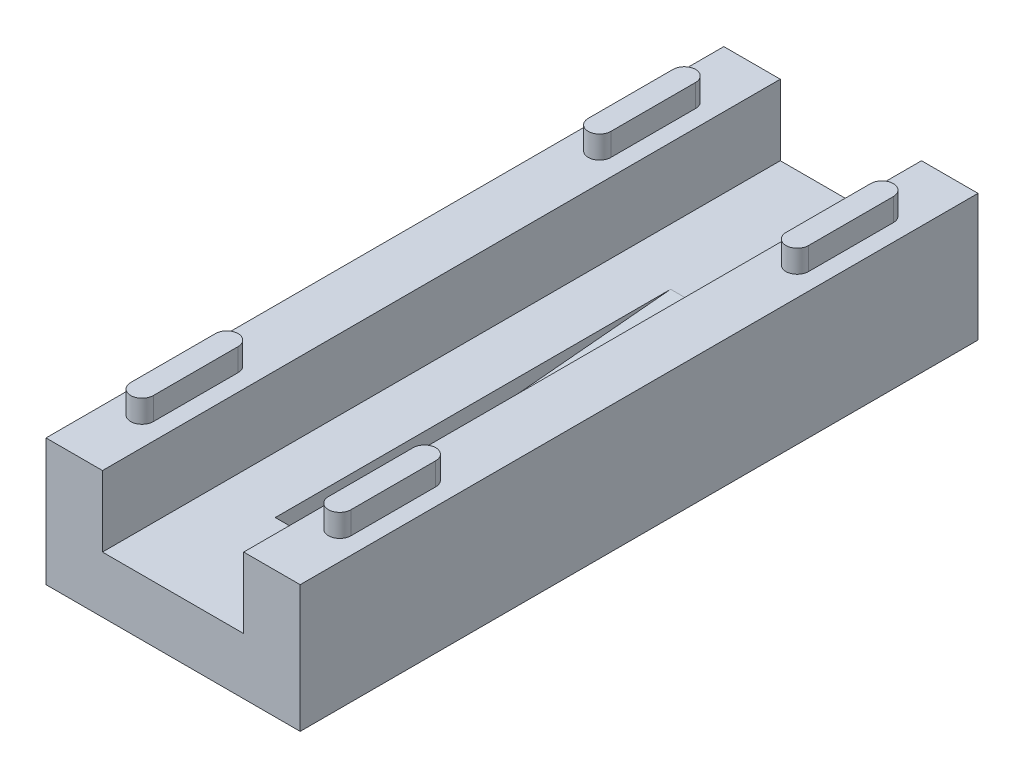
ISO-10303-21;
HEADER;
FILE_DESCRIPTION(('STEP AP214'),'2;1');
FILE_NAME('part.step','',(''),(''),'','','');
FILE_SCHEMA(('AUTOMOTIVE_DESIGN { 1 0 10303 214 1 1 1 1 }'));
ENDSEC;
DATA;
#1=APPLICATION_CONTEXT('core data for automotive mechanical design processes');
#2=APPLICATION_PROTOCOL_DEFINITION('international standard','automotive_design',2000,#1);
#3=PRODUCT_CONTEXT('',#1,'mechanical');
#4=PRODUCT('Part','Part','',(#3));
#5=PRODUCT_RELATED_PRODUCT_CATEGORY('part','',(#4));
#6=PRODUCT_DEFINITION_FORMATION('','',#4);
#7=PRODUCT_DEFINITION_CONTEXT('part definition',#1,'design');
#8=PRODUCT_DEFINITION('design','',#6,#7);
#9=PRODUCT_DEFINITION_SHAPE('','',#8);
#10=(LENGTH_UNIT() NAMED_UNIT(*) SI_UNIT(.MILLI.,.METRE.));
#11=(NAMED_UNIT(*) PLANE_ANGLE_UNIT() SI_UNIT($,.RADIAN.));
#12=(NAMED_UNIT(*) SI_UNIT($,.STERADIAN.) SOLID_ANGLE_UNIT());
#13=UNCERTAINTY_MEASURE_WITH_UNIT(LENGTH_MEASURE(1.E-05),#10,'distance_accuracy_value','');
#14=(GEOMETRIC_REPRESENTATION_CONTEXT(3) GLOBAL_UNCERTAINTY_ASSIGNED_CONTEXT((#13)) GLOBAL_UNIT_ASSIGNED_CONTEXT((#10,
#11,#12)) REPRESENTATION_CONTEXT('',''));
#15=CARTESIAN_POINT('',(0.,0.,0.));
#16=DIRECTION('',(0.,0.,1.));
#17=DIRECTION('',(1.,0.,0.));
#18=AXIS2_PLACEMENT_3D('',#15,#16,#17);
#19=CARTESIAN_POINT('',(22.5,12.5,120.));
#20=DIRECTION('',(0.,-1.,0.));
#21=DIRECTION('',(0.,0.,-1.));
#22=AXIS2_PLACEMENT_3D('',#19,#20,#21);
#23=PLANE('',#22);
#24=DIRECTION('',(-1.,0.,0.));
#25=VECTOR('',#24,1.);
#26=CARTESIAN_POINT('',(22.5,12.5,0.));
#27=LINE('',#26,#25);
#28=CARTESIAN_POINT('',(22.5,12.5,0.));
#29=VERTEX_POINT('',#28);
#30=CARTESIAN_POINT('',(12.5,12.5,0.));
#31=VERTEX_POINT('',#30);
#32=EDGE_CURVE('E487',#29,#31,#27,.T.);
#33=ORIENTED_EDGE('',*,*,#32,.T.);
#34=DIRECTION('',(0.,0.,-1.));
#35=VECTOR('',#34,1.);
#36=CARTESIAN_POINT('',(12.5,12.5,120.));
#37=LINE('',#36,#35);
#38=CARTESIAN_POINT('',(12.5,12.5,120.));
#39=VERTEX_POINT('',#38);
#40=EDGE_CURVE('E502',#39,#31,#37,.T.);
#41=ORIENTED_EDGE('',*,*,#40,.F.);
#42=DIRECTION('',(-1.,0.,0.));
#43=VECTOR('',#42,1.);
#44=CARTESIAN_POINT('',(22.5,12.5,120.));
#45=LINE('',#44,#43);
#46=CARTESIAN_POINT('',(22.5,12.5,120.));
#47=VERTEX_POINT('',#46);
#48=EDGE_CURVE('E462',#47,#39,#45,.T.);
#49=ORIENTED_EDGE('',*,*,#48,.F.);
#50=DIRECTION('',(0.,0.,-1.));
#51=VECTOR('',#50,1.);
#52=CARTESIAN_POINT('',(22.5,12.5,120.));
#53=LINE('',#52,#51);
#54=EDGE_CURVE('E506',#47,#29,#53,.T.);
#55=ORIENTED_EDGE('',*,*,#54,.T.);
#56=EDGE_LOOP('',(#33,#41,#49,#55));
#57=FACE_BOUND('',#56,.T.);
#58=DIRECTION('',(0.,0.,1.));
#59=VECTOR('',#58,1.);
#60=CARTESIAN_POINT('',(19.4999999999985,12.5,108.));
#61=LINE('',#60,#59);
#62=CARTESIAN_POINT('',(19.4999999999987,12.5,93.0000000000003));
#63=VERTEX_POINT('',#62);
#64=CARTESIAN_POINT('',(19.4999999999985,12.5,108.));
#65=VERTEX_POINT('',#64);
#66=EDGE_CURVE('E344',#63,#65,#61,.T.);
#67=ORIENTED_EDGE('',*,*,#66,.T.);
#68=CARTESIAN_POINT('',(17.4999999999985,12.5,108.));
#69=DIRECTION('',(0.,-1.,0.));
#70=DIRECTION('',(-1.,0.,0.));
#71=AXIS2_PLACEMENT_3D('',#68,#69,#70);
#72=CIRCLE('',#71,2.);
#73=CARTESIAN_POINT('',(15.4999999999985,12.5,108.));
#74=VERTEX_POINT('',#73);
#75=EDGE_CURVE('E322',#65,#74,#72,.T.);
#76=ORIENTED_EDGE('',*,*,#75,.T.);
#77=DIRECTION('',(0.,0.,-1.));
#78=VECTOR('',#77,1.);
#79=CARTESIAN_POINT('',(15.4999999999987,12.5,93.0000000000002));
#80=LINE('',#79,#78);
#81=CARTESIAN_POINT('',(15.4999999999987,12.5,93.0000000000002));
#82=VERTEX_POINT('',#81);
#83=EDGE_CURVE('E328',#74,#82,#80,.T.);
#84=ORIENTED_EDGE('',*,*,#83,.T.);
#85=CARTESIAN_POINT('',(17.4999999999987,12.5,93.0000000000003));
#86=DIRECTION('',(0.,-1.,0.));
#87=DIRECTION('',(1.,0.,0.));
#88=AXIS2_PLACEMENT_3D('',#85,#86,#87);
#89=CIRCLE('',#88,2.);
#90=EDGE_CURVE('E348',#82,#63,#89,.T.);
#91=ORIENTED_EDGE('',*,*,#90,.T.);
#92=EDGE_LOOP('',(#67,#76,#84,#91));
#93=FACE_BOUND('',#92,.T.);
#94=CARTESIAN_POINT('',(17.4999999999985,12.5,11.9999999999997));
#95=DIRECTION('',(0.,1.,0.));
#96=DIRECTION('',(-1.,0.,0.));
#97=AXIS2_PLACEMENT_3D('',#94,#95,#96);
#98=CIRCLE('',#97,2.);
#99=CARTESIAN_POINT('',(19.4999999999985,12.5,11.9999999999997));
#100=VERTEX_POINT('',#99);
#101=CARTESIAN_POINT('',(15.4999999999985,12.5,11.9999999999998));
#102=VERTEX_POINT('',#101);
#103=EDGE_CURVE('E239',#100,#102,#98,.T.);
#104=ORIENTED_EDGE('',*,*,#103,.F.);
#105=DIRECTION('',(0.,0.,-1.));
#106=VECTOR('',#105,1.);
#107=CARTESIAN_POINT('',(19.4999999999985,12.5,11.9999999999997));
#108=LINE('',#107,#106);
#109=CARTESIAN_POINT('',(19.4999999999987,12.5,26.9999999999997));
#110=VERTEX_POINT('',#109);
#111=EDGE_CURVE('E286',#110,#100,#108,.T.);
#112=ORIENTED_EDGE('',*,*,#111,.F.);
#113=CARTESIAN_POINT('',(17.4999999999987,12.5,26.9999999999997));
#114=DIRECTION('',(0.,1.,0.));
#115=DIRECTION('',(1.,0.,0.));
#116=AXIS2_PLACEMENT_3D('',#113,#114,#115);
#117=CIRCLE('',#116,2.);
#118=CARTESIAN_POINT('',(15.4999999999987,12.5,26.9999999999998));
#119=VERTEX_POINT('',#118);
#120=EDGE_CURVE('E301',#119,#110,#117,.T.);
#121=ORIENTED_EDGE('',*,*,#120,.F.);
#122=DIRECTION('',(0.,0.,1.));
#123=VECTOR('',#122,1.);
#124=CARTESIAN_POINT('',(15.4999999999987,12.5,26.9999999999998));
#125=LINE('',#124,#123);
#126=EDGE_CURVE('E71',#102,#119,#125,.T.);
#127=ORIENTED_EDGE('',*,*,#126,.F.);
#128=EDGE_LOOP('',(#104,#112,#121,#127));
#129=FACE_BOUND('',#128,.T.);
#130=ADVANCED_FACE('F47',(#57,#93,#129),#23,.F.);
#131=CARTESIAN_POINT('',(-12.5,12.5,120.));
#132=DIRECTION('',(0.,-1.,0.));
#133=DIRECTION('',(1.,0.,0.));
#134=AXIS2_PLACEMENT_3D('',#131,#132,#133);
#135=PLANE('',#134);
#136=DIRECTION('',(0.,0.,-1.));
#137=VECTOR('',#136,1.);
#138=CARTESIAN_POINT('',(-19.5,12.5,12.));
#139=LINE('',#138,#137);
#140=CARTESIAN_POINT('',(-19.5,12.5,27.));
#141=VERTEX_POINT('',#140);
#142=CARTESIAN_POINT('',(-19.5,12.5,12.));
#143=VERTEX_POINT('',#142);
#144=EDGE_CURVE('E266',#141,#143,#139,.T.);
#145=ORIENTED_EDGE('',*,*,#144,.T.);
#146=CARTESIAN_POINT('',(-17.5,12.5,12.));
#147=DIRECTION('',(0.,-1.,0.));
#148=DIRECTION('',(1.,0.,0.));
#149=AXIS2_PLACEMENT_3D('',#146,#147,#148);
#150=CIRCLE('',#149,2.);
#151=CARTESIAN_POINT('',(-15.5,12.5,12.));
#152=VERTEX_POINT('',#151);
#153=EDGE_CURVE('E233',#143,#152,#150,.T.);
#154=ORIENTED_EDGE('',*,*,#153,.T.);
#155=DIRECTION('',(0.,0.,1.));
#156=VECTOR('',#155,1.);
#157=CARTESIAN_POINT('',(-15.5,12.5,27.));
#158=LINE('',#157,#156);
#159=CARTESIAN_POINT('',(-15.5,12.5,27.));
#160=VERTEX_POINT('',#159);
#161=EDGE_CURVE('E251',#152,#160,#158,.T.);
#162=ORIENTED_EDGE('',*,*,#161,.T.);
#163=CARTESIAN_POINT('',(-17.5,12.5,27.));
#164=DIRECTION('',(0.,-1.,0.));
#165=DIRECTION('',(-1.,0.,0.));
#166=AXIS2_PLACEMENT_3D('',#163,#164,#165);
#167=CIRCLE('',#166,2.);
#168=EDGE_CURVE('E63',#160,#141,#167,.T.);
#169=ORIENTED_EDGE('',*,*,#168,.T.);
#170=EDGE_LOOP('',(#145,#154,#162,#169));
#171=FACE_BOUND('',#170,.T.);
#172=DIRECTION('',(-1.,0.,0.));
#173=VECTOR('',#172,1.);
#174=CARTESIAN_POINT('',(-12.5,12.5,0.));
#175=LINE('',#174,#173);
#176=CARTESIAN_POINT('',(-12.5,12.5,0.));
#177=VERTEX_POINT('',#176);
#178=CARTESIAN_POINT('',(-22.5,12.5,0.));
#179=VERTEX_POINT('',#178);
#180=EDGE_CURVE('E475',#177,#179,#175,.T.);
#181=ORIENTED_EDGE('',*,*,#180,.T.);
#182=DIRECTION('',(0.,0.,-1.));
#183=VECTOR('',#182,1.);
#184=CARTESIAN_POINT('',(-22.5,12.5,120.));
#185=LINE('',#184,#183);
#186=CARTESIAN_POINT('',(-22.5,12.5,120.));
#187=VERTEX_POINT('',#186);
#188=EDGE_CURVE('E56',#187,#179,#185,.T.);
#189=ORIENTED_EDGE('',*,*,#188,.F.);
#190=DIRECTION('',(-1.,0.,0.));
#191=VECTOR('',#190,1.);
#192=CARTESIAN_POINT('',(-12.5,12.5,120.));
#193=LINE('',#192,#191);
#194=CARTESIAN_POINT('',(-12.5,12.5,120.));
#195=VERTEX_POINT('',#194);
#196=EDGE_CURVE('E449',#195,#187,#193,.T.);
#197=ORIENTED_EDGE('',*,*,#196,.F.);
#198=DIRECTION('',(0.,0.,-1.));
#199=VECTOR('',#198,1.);
#200=CARTESIAN_POINT('',(-12.5,12.5,120.));
#201=LINE('',#200,#199);
#202=EDGE_CURVE('E11',#195,#177,#201,.T.);
#203=ORIENTED_EDGE('',*,*,#202,.T.);
#204=EDGE_LOOP('',(#181,#189,#197,#203));
#205=FACE_BOUND('',#204,.T.);
#206=CARTESIAN_POINT('',(-17.5,12.5,108.));
#207=DIRECTION('',(0.,1.,0.));
#208=DIRECTION('',(1.,0.,0.));
#209=AXIS2_PLACEMENT_3D('',#206,#207,#208);
#210=CIRCLE('',#209,2.);
#211=CARTESIAN_POINT('',(-19.5,12.5,108.));
#212=VERTEX_POINT('',#211);
#213=CARTESIAN_POINT('',(-15.5,12.5,108.));
#214=VERTEX_POINT('',#213);
#215=EDGE_CURVE('E367',#212,#214,#210,.T.);
#216=ORIENTED_EDGE('',*,*,#215,.F.);
#217=DIRECTION('',(0.,0.,1.));
#218=VECTOR('',#217,1.);
#219=CARTESIAN_POINT('',(-19.5,12.5,108.));
#220=LINE('',#219,#218);
#221=CARTESIAN_POINT('',(-19.5,12.5,93.));
#222=VERTEX_POINT('',#221);
#223=EDGE_CURVE('E373',#222,#212,#220,.T.);
#224=ORIENTED_EDGE('',*,*,#223,.F.);
#225=CARTESIAN_POINT('',(-17.5,12.5,93.));
#226=DIRECTION('',(0.,1.,0.));
#227=DIRECTION('',(-1.,0.,0.));
#228=AXIS2_PLACEMENT_3D('',#225,#226,#227);
#229=CIRCLE('',#228,2.);
#230=CARTESIAN_POINT('',(-15.5,12.5,93.));
#231=VERTEX_POINT('',#230);
#232=EDGE_CURVE('E390',#231,#222,#229,.T.);
#233=ORIENTED_EDGE('',*,*,#232,.F.);
#234=DIRECTION('',(0.,0.,-1.));
#235=VECTOR('',#234,1.);
#236=CARTESIAN_POINT('',(-15.5,12.5,93.));
#237=LINE('',#236,#235);
#238=EDGE_CURVE('E386',#214,#231,#237,.T.);
#239=ORIENTED_EDGE('',*,*,#238,.F.);
#240=EDGE_LOOP('',(#216,#224,#233,#239));
#241=FACE_BOUND('',#240,.T.);
#242=ADVANCED_FACE('F547',(#171,#205,#241),#135,.F.);
#243=CARTESIAN_POINT('',(12.5,0.,120.));
#244=DIRECTION('',(0.,-1.,0.));
#245=DIRECTION('',(1.,0.,0.));
#246=AXIS2_PLACEMENT_3D('',#243,#244,#245);
#247=PLANE('',#246);
#248=DIRECTION('',(-1.,0.,0.));
#249=VECTOR('',#248,1.);
#250=CARTESIAN_POINT('',(12.5,0.,0.));
#251=LINE('',#250,#249);
#252=CARTESIAN_POINT('',(12.5,0.,0.));
#253=VERTEX_POINT('',#252);
#254=CARTESIAN_POINT('',(-12.5,0.,0.));
#255=VERTEX_POINT('',#254);
#256=EDGE_CURVE('E450',#253,#255,#251,.T.);
#257=ORIENTED_EDGE('',*,*,#256,.T.);
#258=DIRECTION('',(0.,0.,-1.));
#259=VECTOR('',#258,1.);
#260=CARTESIAN_POINT('',(-12.5,0.,120.));
#261=LINE('',#260,#259);
#262=CARTESIAN_POINT('',(-12.5,0.,120.));
#263=VERTEX_POINT('',#262);
#264=EDGE_CURVE('E471',#263,#255,#261,.T.);
#265=ORIENTED_EDGE('',*,*,#264,.F.);
#266=DIRECTION('',(-1.,0.,0.));
#267=VECTOR('',#266,1.);
#268=CARTESIAN_POINT('',(12.5,0.,120.));
#269=LINE('',#268,#267);
#270=CARTESIAN_POINT('',(12.5,0.,120.));
#271=VERTEX_POINT('',#270);
#272=EDGE_CURVE('E468',#271,#263,#269,.T.);
#273=ORIENTED_EDGE('',*,*,#272,.F.);
#274=DIRECTION('',(0.,0.,-1.));
#275=VECTOR('',#274,1.);
#276=CARTESIAN_POINT('',(12.5,0.,120.));
#277=LINE('',#276,#275);
#278=EDGE_CURVE('E498',#271,#253,#277,.T.);
#279=ORIENTED_EDGE('',*,*,#278,.T.);
#280=EDGE_LOOP('',(#257,#265,#273,#279));
#281=FACE_BOUND('',#280,.T.);
#282=DIRECTION('',(0.,0.,1.));
#283=VECTOR('',#282,1.);
#284=CARTESIAN_POINT('',(2.5,0.,29.416511254496));
#285=LINE('',#284,#283);
#286=CARTESIAN_POINT('',(2.5,0.,29.416511254496));
#287=VERTEX_POINT('',#286);
#288=CARTESIAN_POINT('',(2.5,0.,99.416511254496));
#289=VERTEX_POINT('',#288);
#290=EDGE_CURVE('E426',#287,#289,#285,.T.);
#291=ORIENTED_EDGE('',*,*,#290,.T.);
#292=DIRECTION('',(-1.,0.,0.));
#293=VECTOR('',#292,1.);
#294=CARTESIAN_POINT('',(2.5,0.,99.416511254496));
#295=LINE('',#294,#293);
#296=CARTESIAN_POINT('',(-2.5,0.,99.416511254496));
#297=VERTEX_POINT('',#296);
#298=EDGE_CURVE('E436',#289,#297,#295,.T.);
#299=ORIENTED_EDGE('',*,*,#298,.T.);
#300=DIRECTION('',(0.,0.,1.));
#301=VECTOR('',#300,1.);
#302=CARTESIAN_POINT('',(-2.5,0.,29.416511254496));
#303=LINE('',#302,#301);
#304=CARTESIAN_POINT('',(-2.5,0.,29.416511254496));
#305=VERTEX_POINT('',#304);
#306=EDGE_CURVE('E415',#305,#297,#303,.T.);
#307=ORIENTED_EDGE('',*,*,#306,.F.);
#308=DIRECTION('',(-1.,0.,0.));
#309=VECTOR('',#308,1.);
#310=CARTESIAN_POINT('',(2.5,0.,29.416511254496));
#311=LINE('',#310,#309);
#312=EDGE_CURVE('E440',#287,#305,#311,.T.);
#313=ORIENTED_EDGE('',*,*,#312,.F.);
#314=EDGE_LOOP('',(#291,#299,#307,#313));
#315=FACE_BOUND('',#314,.T.);
#316=ADVANCED_FACE('F554',(#281,#315),#247,.F.);
#317=CARTESIAN_POINT('',(-12.5,0.,120.));
#318=DIRECTION('',(-1.,0.,0.));
#319=DIRECTION('',(0.,0.,1.));
#320=AXIS2_PLACEMENT_3D('',#317,#318,#319);
#321=PLANE('',#320);
#322=DIRECTION('',(0.,1.,0.));
#323=VECTOR('',#322,1.);
#324=CARTESIAN_POINT('',(-12.5,0.,0.));
#325=LINE('',#324,#323);
#326=EDGE_CURVE('E444',#255,#177,#325,.T.);
#327=ORIENTED_EDGE('',*,*,#326,.T.);
#328=ORIENTED_EDGE('',*,*,#202,.F.);
#329=DIRECTION('',(0.,1.,0.));
#330=VECTOR('',#329,1.);
#331=CARTESIAN_POINT('',(-12.5,0.,120.));
#332=LINE('',#331,#330);
#333=EDGE_CURVE('E445',#263,#195,#332,.T.);
#334=ORIENTED_EDGE('',*,*,#333,.F.);
#335=ORIENTED_EDGE('',*,*,#264,.T.);
#336=EDGE_LOOP('',(#327,#328,#334,#335));
#337=FACE_BOUND('',#336,.T.);
#338=ADVANCED_FACE('F49',(#337),#321,.F.);
#339=CARTESIAN_POINT('',(-22.5,12.5,120.));
#340=DIRECTION('',(1.,0.,0.));
#341=DIRECTION('',(0.,0.,-1.));
#342=AXIS2_PLACEMENT_3D('',#339,#340,#341);
#343=PLANE('',#342);
#344=DIRECTION('',(0.,-1.,0.));
#345=VECTOR('',#344,1.);
#346=CARTESIAN_POINT('',(-22.5,12.5,0.));
#347=LINE('',#346,#345);
#348=CARTESIAN_POINT('',(-22.5,-10.,0.));
#349=VERTEX_POINT('',#348);
#350=EDGE_CURVE('E478',#179,#349,#347,.T.);
#351=ORIENTED_EDGE('',*,*,#350,.T.);
#352=DIRECTION('',(0.,0.,-1.));
#353=VECTOR('',#352,1.);
#354=CARTESIAN_POINT('',(-22.5,-10.,120.));
#355=LINE('',#354,#353);
#356=CARTESIAN_POINT('',(-22.5,-10.,120.));
#357=VERTEX_POINT('',#356);
#358=EDGE_CURVE('E514',#357,#349,#355,.T.);
#359=ORIENTED_EDGE('',*,*,#358,.F.);
#360=DIRECTION('',(0.,-1.,0.));
#361=VECTOR('',#360,1.);
#362=CARTESIAN_POINT('',(-22.5,12.5,120.));
#363=LINE('',#362,#361);
#364=EDGE_CURVE('E453',#187,#357,#363,.T.);
#365=ORIENTED_EDGE('',*,*,#364,.F.);
#366=ORIENTED_EDGE('',*,*,#188,.T.);
#367=EDGE_LOOP('',(#351,#359,#365,#366));
#368=FACE_BOUND('',#367,.T.);
#369=ADVANCED_FACE('F524',(#368),#343,.F.);
#370=CARTESIAN_POINT('',(-22.5,-10.,120.));
#371=DIRECTION('',(0.,1.,0.));
#372=DIRECTION('',(-1.,0.,0.));
#373=AXIS2_PLACEMENT_3D('',#370,#371,#372);
#374=PLANE('',#373);
#375=DIRECTION('',(1.,0.,0.));
#376=VECTOR('',#375,1.);
#377=CARTESIAN_POINT('',(-22.5,-10.,0.));
#378=LINE('',#377,#376);
#379=CARTESIAN_POINT('',(22.5,-10.,0.));
#380=VERTEX_POINT('',#379);
#381=EDGE_CURVE('E481',#349,#380,#378,.T.);
#382=ORIENTED_EDGE('',*,*,#381,.T.);
#383=DIRECTION('',(0.,0.,-1.));
#384=VECTOR('',#383,1.);
#385=CARTESIAN_POINT('',(22.5,-10.,120.));
#386=LINE('',#385,#384);
#387=CARTESIAN_POINT('',(22.5,-10.,120.));
#388=VERTEX_POINT('',#387);
#389=EDGE_CURVE('E510',#388,#380,#386,.T.);
#390=ORIENTED_EDGE('',*,*,#389,.F.);
#391=DIRECTION('',(1.,0.,0.));
#392=VECTOR('',#391,1.);
#393=CARTESIAN_POINT('',(-22.5,-10.,120.));
#394=LINE('',#393,#392);
#395=EDGE_CURVE('E456',#357,#388,#394,.T.);
#396=ORIENTED_EDGE('',*,*,#395,.F.);
#397=ORIENTED_EDGE('',*,*,#358,.T.);
#398=EDGE_LOOP('',(#382,#390,#396,#397));
#399=FACE_BOUND('',#398,.T.);
#400=ADVANCED_FACE('F535',(#399),#374,.F.);
#401=CARTESIAN_POINT('',(22.5,-10.,120.));
#402=DIRECTION('',(-1.,0.,0.));
#403=DIRECTION('',(0.,-1.,0.));
#404=AXIS2_PLACEMENT_3D('',#401,#402,#403);
#405=PLANE('',#404);
#406=DIRECTION('',(0.,1.,0.));
#407=VECTOR('',#406,1.);
#408=CARTESIAN_POINT('',(22.5,-10.,0.));
#409=LINE('',#408,#407);
#410=EDGE_CURVE('E484',#380,#29,#409,.T.);
#411=ORIENTED_EDGE('',*,*,#410,.T.);
#412=ORIENTED_EDGE('',*,*,#54,.F.);
#413=DIRECTION('',(0.,1.,0.));
#414=VECTOR('',#413,1.);
#415=CARTESIAN_POINT('',(22.5,-10.,120.));
#416=LINE('',#415,#414);
#417=EDGE_CURVE('E459',#388,#47,#416,.T.);
#418=ORIENTED_EDGE('',*,*,#417,.F.);
#419=ORIENTED_EDGE('',*,*,#389,.T.);
#420=EDGE_LOOP('',(#411,#412,#418,#419));
#421=FACE_BOUND('',#420,.T.);
#422=ADVANCED_FACE('F539',(#421),#405,.F.);
#423=CARTESIAN_POINT('',(12.5,12.5,120.));
#424=DIRECTION('',(1.,0.,0.));
#425=DIRECTION('',(0.,1.,0.));
#426=AXIS2_PLACEMENT_3D('',#423,#424,#425);
#427=PLANE('',#426);
#428=DIRECTION('',(0.,-1.,0.));
#429=VECTOR('',#428,1.);
#430=CARTESIAN_POINT('',(12.5,12.5,0.));
#431=LINE('',#430,#429);
#432=EDGE_CURVE('E490',#31,#253,#431,.T.);
#433=ORIENTED_EDGE('',*,*,#432,.T.);
#434=ORIENTED_EDGE('',*,*,#278,.F.);
#435=DIRECTION('',(0.,-1.,0.));
#436=VECTOR('',#435,1.);
#437=CARTESIAN_POINT('',(12.5,12.5,120.));
#438=LINE('',#437,#436);
#439=EDGE_CURVE('E465',#39,#271,#438,.T.);
#440=ORIENTED_EDGE('',*,*,#439,.F.);
#441=ORIENTED_EDGE('',*,*,#40,.T.);
#442=EDGE_LOOP('',(#433,#434,#440,#441));
#443=FACE_BOUND('',#442,.T.);
#444=ADVANCED_FACE('F560',(#443),#427,.F.);
#445=CARTESIAN_POINT('',(0.,0.,120.));
#446=DIRECTION('',(0.,0.,1.));
#447=DIRECTION('',(1.,0.,0.));
#448=AXIS2_PLACEMENT_3D('',#445,#446,#447);
#449=PLANE('',#448);
#450=ORIENTED_EDGE('',*,*,#333,.T.);
#451=ORIENTED_EDGE('',*,*,#196,.T.);
#452=ORIENTED_EDGE('',*,*,#364,.T.);
#453=ORIENTED_EDGE('',*,*,#395,.T.);
#454=ORIENTED_EDGE('',*,*,#417,.T.);
#455=ORIENTED_EDGE('',*,*,#48,.T.);
#456=ORIENTED_EDGE('',*,*,#439,.T.);
#457=ORIENTED_EDGE('',*,*,#272,.T.);
#458=EDGE_LOOP('',(#450,#451,#452,#453,#454,#455,#456,#457));
#459=FACE_BOUND('',#458,.T.);
#460=ADVANCED_FACE('F543',(#459),#449,.T.);
#461=CARTESIAN_POINT('',(0.,0.,0.));
#462=DIRECTION('',(0.,0.,1.));
#463=DIRECTION('',(1.,0.,0.));
#464=AXIS2_PLACEMENT_3D('',#461,#462,#463);
#465=PLANE('',#464);
#466=ORIENTED_EDGE('',*,*,#326,.F.);
#467=ORIENTED_EDGE('',*,*,#256,.F.);
#468=ORIENTED_EDGE('',*,*,#432,.F.);
#469=ORIENTED_EDGE('',*,*,#32,.F.);
#470=ORIENTED_EDGE('',*,*,#410,.F.);
#471=ORIENTED_EDGE('',*,*,#381,.F.);
#472=ORIENTED_EDGE('',*,*,#350,.F.);
#473=ORIENTED_EDGE('',*,*,#180,.F.);
#474=EDGE_LOOP('',(#466,#467,#468,#469,#470,#471,#472,#473));
#475=FACE_BOUND('',#474,.T.);
#476=ADVANCED_FACE('F530',(#475),#465,.F.);
#477=CARTESIAN_POINT('',(2.5,-6.50000000000001,99.416511254496));
#478=DIRECTION('',(0.,0.995716456666751,0.0924593852619127));
#479=DIRECTION('',(0.,-0.0924593852619127,0.995716456666751));
#480=AXIS2_PLACEMENT_3D('',#477,#478,#479);
#481=PLANE('',#480);
#482=DIRECTION('',(-1.,0.,0.));
#483=VECTOR('',#482,1.);
#484=CARTESIAN_POINT('',(2.5,-6.50000000000001,99.416511254496));
#485=LINE('',#484,#483);
#486=CARTESIAN_POINT('',(2.5,-6.50000000000001,99.416511254496));
#487=VERTEX_POINT('',#486);
#488=CARTESIAN_POINT('',(-2.5,-6.50000000000001,99.416511254496));
#489=VERTEX_POINT('',#488);
#490=EDGE_CURVE('E433',#487,#489,#485,.T.);
#491=ORIENTED_EDGE('',*,*,#490,.F.);
#492=DIRECTION('',(0.,0.0924593852619127,-0.995716456666751));
#493=VECTOR('',#492,1.);
#494=CARTESIAN_POINT('',(2.5,-6.50000000000001,99.416511254496));
#495=LINE('',#494,#493);
#496=EDGE_CURVE('E422',#487,#287,#495,.T.);
#497=ORIENTED_EDGE('',*,*,#496,.T.);
#498=ORIENTED_EDGE('',*,*,#312,.T.);
#499=DIRECTION('',(0.,0.0924593852619127,-0.995716456666751));
#500=VECTOR('',#499,1.);
#501=CARTESIAN_POINT('',(-2.5,-6.50000000000001,99.416511254496));
#502=LINE('',#501,#500);
#503=EDGE_CURVE('E412',#489,#305,#502,.T.);
#504=ORIENTED_EDGE('',*,*,#503,.F.);
#505=EDGE_LOOP('',(#491,#497,#498,#504));
#506=FACE_BOUND('',#505,.T.);
#507=ADVANCED_FACE('F644',(#506),#481,.T.);
#508=CARTESIAN_POINT('',(2.5,0.,99.416511254496));
#509=DIRECTION('',(0.,0.,-1.));
#510=DIRECTION('',(-1.,0.,0.));
#511=AXIS2_PLACEMENT_3D('',#508,#509,#510);
#512=PLANE('',#511);
#513=ORIENTED_EDGE('',*,*,#298,.F.);
#514=DIRECTION('',(0.,-1.,0.));
#515=VECTOR('',#514,1.);
#516=CARTESIAN_POINT('',(2.5,0.,99.416511254496));
#517=LINE('',#516,#515);
#518=EDGE_CURVE('E430',#289,#487,#517,.T.);
#519=ORIENTED_EDGE('',*,*,#518,.T.);
#520=ORIENTED_EDGE('',*,*,#490,.T.);
#521=DIRECTION('',(0.,-1.,0.));
#522=VECTOR('',#521,1.);
#523=CARTESIAN_POINT('',(-2.5,0.,99.416511254496));
#524=LINE('',#523,#522);
#525=EDGE_CURVE('E418',#297,#489,#524,.T.);
#526=ORIENTED_EDGE('',*,*,#525,.F.);
#527=EDGE_LOOP('',(#513,#519,#520,#526));
#528=FACE_BOUND('',#527,.T.);
#529=ADVANCED_FACE('F640',(#528),#512,.T.);
#530=CARTESIAN_POINT('',(2.5,0.,0.));
#531=DIRECTION('',(-1.,0.,0.));
#532=DIRECTION('',(0.,0.,1.));
#533=AXIS2_PLACEMENT_3D('',#530,#531,#532);
#534=PLANE('',#533);
#535=ORIENTED_EDGE('',*,*,#496,.F.);
#536=ORIENTED_EDGE('',*,*,#518,.F.);
#537=ORIENTED_EDGE('',*,*,#290,.F.);
#538=EDGE_LOOP('',(#535,#536,#537));
#539=FACE_BOUND('',#538,.T.);
#540=ADVANCED_FACE('F636',(#539),#534,.T.);
#541=CARTESIAN_POINT('',(-2.5,0.,0.));
#542=DIRECTION('',(-1.,0.,0.));
#543=DIRECTION('',(0.,0.,1.));
#544=AXIS2_PLACEMENT_3D('',#541,#542,#543);
#545=PLANE('',#544);
#546=ORIENTED_EDGE('',*,*,#503,.T.);
#547=ORIENTED_EDGE('',*,*,#306,.T.);
#548=ORIENTED_EDGE('',*,*,#525,.T.);
#549=EDGE_LOOP('',(#546,#547,#548));
#550=FACE_BOUND('',#549,.T.);
#551=ADVANCED_FACE('F632',(#550),#545,.F.);
#552=CARTESIAN_POINT('',(-17.5,16.5,108.));
#553=DIRECTION('',(0.,-1.,0.));
#554=DIRECTION('',(1.,0.,0.));
#555=AXIS2_PLACEMENT_3D('',#552,#553,#554);
#556=CYLINDRICAL_SURFACE('',#555,2.);
#557=ORIENTED_EDGE('',*,*,#215,.T.);
#558=DIRECTION('',(0.,-1.,0.));
#559=VECTOR('',#558,1.);
#560=CARTESIAN_POINT('',(-15.5,16.5,108.));
#561=LINE('',#560,#559);
#562=CARTESIAN_POINT('',(-15.5,16.5,108.));
#563=VERTEX_POINT('',#562);
#564=EDGE_CURVE('E408',#563,#214,#561,.T.);
#565=ORIENTED_EDGE('',*,*,#564,.F.);
#566=CARTESIAN_POINT('',(-17.5,16.5,108.));
#567=DIRECTION('',(0.,1.,0.));
#568=DIRECTION('',(1.,0.,0.));
#569=AXIS2_PLACEMENT_3D('',#566,#567,#568);
#570=CIRCLE('',#569,2.);
#571=CARTESIAN_POINT('',(-19.5,16.5,108.));
#572=VERTEX_POINT('',#571);
#573=EDGE_CURVE('E368',#572,#563,#570,.T.);
#574=ORIENTED_EDGE('',*,*,#573,.F.);
#575=DIRECTION('',(0.,-1.,0.));
#576=VECTOR('',#575,1.);
#577=CARTESIAN_POINT('',(-19.5,16.5,108.));
#578=LINE('',#577,#576);
#579=EDGE_CURVE('E382',#572,#212,#578,.T.);
#580=ORIENTED_EDGE('',*,*,#579,.T.);
#581=EDGE_LOOP('',(#557,#565,#574,#580));
#582=FACE_BOUND('',#581,.T.);
#583=ADVANCED_FACE('F628',(#582),#556,.T.);
#584=CARTESIAN_POINT('',(-15.5,16.5,93.));
#585=DIRECTION('',(-1.,0.,0.));
#586=DIRECTION('',(0.,0.,1.));
#587=AXIS2_PLACEMENT_3D('',#584,#585,#586);
#588=PLANE('',#587);
#589=ORIENTED_EDGE('',*,*,#238,.T.);
#590=DIRECTION('',(0.,-1.,0.));
#591=VECTOR('',#590,1.);
#592=CARTESIAN_POINT('',(-15.5,16.5,93.));
#593=LINE('',#592,#591);
#594=CARTESIAN_POINT('',(-15.5,16.5,93.));
#595=VERTEX_POINT('',#594);
#596=EDGE_CURVE('E404',#595,#231,#593,.T.);
#597=ORIENTED_EDGE('',*,*,#596,.F.);
#598=DIRECTION('',(0.,0.,-1.));
#599=VECTOR('',#598,1.);
#600=CARTESIAN_POINT('',(-15.5,16.5,93.));
#601=LINE('',#600,#599);
#602=EDGE_CURVE('E372',#563,#595,#601,.T.);
#603=ORIENTED_EDGE('',*,*,#602,.F.);
#604=ORIENTED_EDGE('',*,*,#564,.T.);
#605=EDGE_LOOP('',(#589,#597,#603,#604));
#606=FACE_BOUND('',#605,.T.);
#607=ADVANCED_FACE('F624',(#606),#588,.F.);
#608=CARTESIAN_POINT('',(-17.5,16.5,93.));
#609=DIRECTION('',(0.,-1.,0.));
#610=DIRECTION('',(1.,0.,0.));
#611=AXIS2_PLACEMENT_3D('',#608,#609,#610);
#612=CYLINDRICAL_SURFACE('',#611,2.);
#613=ORIENTED_EDGE('',*,*,#232,.T.);
#614=DIRECTION('',(0.,-1.,0.));
#615=VECTOR('',#614,1.);
#616=CARTESIAN_POINT('',(-19.5,16.5,93.));
#617=LINE('',#616,#615);
#618=CARTESIAN_POINT('',(-19.5,16.5,93.));
#619=VERTEX_POINT('',#618);
#620=EDGE_CURVE('E400',#619,#222,#617,.T.);
#621=ORIENTED_EDGE('',*,*,#620,.F.);
#622=CARTESIAN_POINT('',(-17.5,16.5,93.));
#623=DIRECTION('',(0.,1.,0.));
#624=DIRECTION('',(-1.,0.,0.));
#625=AXIS2_PLACEMENT_3D('',#622,#623,#624);
#626=CIRCLE('',#625,2.);
#627=EDGE_CURVE('E376',#595,#619,#626,.T.);
#628=ORIENTED_EDGE('',*,*,#627,.F.);
#629=ORIENTED_EDGE('',*,*,#596,.T.);
#630=EDGE_LOOP('',(#613,#621,#628,#629));
#631=FACE_BOUND('',#630,.T.);
#632=ADVANCED_FACE('F620',(#631),#612,.T.);
#633=CARTESIAN_POINT('',(-19.5,16.5,108.));
#634=DIRECTION('',(1.,0.,0.));
#635=DIRECTION('',(0.,0.,-1.));
#636=AXIS2_PLACEMENT_3D('',#633,#634,#635);
#637=PLANE('',#636);
#638=ORIENTED_EDGE('',*,*,#223,.T.);
#639=ORIENTED_EDGE('',*,*,#579,.F.);
#640=DIRECTION('',(0.,0.,1.));
#641=VECTOR('',#640,1.);
#642=CARTESIAN_POINT('',(-19.5,16.5,108.));
#643=LINE('',#642,#641);
#644=EDGE_CURVE('E379',#619,#572,#643,.T.);
#645=ORIENTED_EDGE('',*,*,#644,.F.);
#646=ORIENTED_EDGE('',*,*,#620,.T.);
#647=EDGE_LOOP('',(#638,#639,#645,#646));
#648=FACE_BOUND('',#647,.T.);
#649=ADVANCED_FACE('F616',(#648),#637,.F.);
#650=CARTESIAN_POINT('',(-17.5,16.5,108.));
#651=DIRECTION('',(0.,-1.,0.));
#652=DIRECTION('',(1.,0.,0.));
#653=AXIS2_PLACEMENT_3D('',#650,#651,#652);
#654=PLANE('',#653);
#655=ORIENTED_EDGE('',*,*,#573,.T.);
#656=ORIENTED_EDGE('',*,*,#602,.T.);
#657=ORIENTED_EDGE('',*,*,#627,.T.);
#658=ORIENTED_EDGE('',*,*,#644,.T.);
#659=EDGE_LOOP('',(#655,#656,#657,#658));
#660=FACE_BOUND('',#659,.T.);
#661=ADVANCED_FACE('F612',(#660),#654,.F.);
#662=CARTESIAN_POINT('',(17.4999999999985,16.5,108.));
#663=DIRECTION('',(0.,-1.,0.));
#664=DIRECTION('',(1.,0.,0.));
#665=AXIS2_PLACEMENT_3D('',#662,#663,#664);
#666=CYLINDRICAL_SURFACE('',#665,2.);
#667=ORIENTED_EDGE('',*,*,#75,.F.);
#668=DIRECTION('',(0.,-1.,0.));
#669=VECTOR('',#668,1.);
#670=CARTESIAN_POINT('',(19.4999999999985,16.5,108.));
#671=LINE('',#670,#669);
#672=CARTESIAN_POINT('',(19.4999999999985,16.5,108.));
#673=VERTEX_POINT('',#672);
#674=EDGE_CURVE('E364',#673,#65,#671,.T.);
#675=ORIENTED_EDGE('',*,*,#674,.F.);
#676=CARTESIAN_POINT('',(17.4999999999985,16.5,108.));
#677=DIRECTION('',(0.,-1.,0.));
#678=DIRECTION('',(-1.,0.,0.));
#679=AXIS2_PLACEMENT_3D('',#676,#677,#678);
#680=CIRCLE('',#679,2.);
#681=CARTESIAN_POINT('',(15.4999999999985,16.5,108.));
#682=VERTEX_POINT('',#681);
#683=EDGE_CURVE('E323',#673,#682,#680,.T.);
#684=ORIENTED_EDGE('',*,*,#683,.T.);
#685=DIRECTION('',(0.,-1.,0.));
#686=VECTOR('',#685,1.);
#687=CARTESIAN_POINT('',(15.4999999999985,16.5,108.));
#688=LINE('',#687,#686);
#689=EDGE_CURVE('E340',#682,#74,#688,.T.);
#690=ORIENTED_EDGE('',*,*,#689,.T.);
#691=EDGE_LOOP('',(#667,#675,#684,#690));
#692=FACE_BOUND('',#691,.T.);
#693=ADVANCED_FACE('F608',(#692),#666,.T.);
#694=CARTESIAN_POINT('',(19.4999999999985,16.5,108.));
#695=DIRECTION('',(1.,0.,0.));
#696=DIRECTION('',(0.,0.,-1.));
#697=AXIS2_PLACEMENT_3D('',#694,#695,#696);
#698=PLANE('',#697);
#699=ORIENTED_EDGE('',*,*,#66,.F.);
#700=DIRECTION('',(0.,-1.,0.));
#701=VECTOR('',#700,1.);
#702=CARTESIAN_POINT('',(19.4999999999987,16.5,93.0000000000003));
#703=LINE('',#702,#701);
#704=CARTESIAN_POINT('',(19.4999999999987,16.5,93.0000000000003));
#705=VERTEX_POINT('',#704);
#706=EDGE_CURVE('E361',#705,#63,#703,.T.);
#707=ORIENTED_EDGE('',*,*,#706,.F.);
#708=DIRECTION('',(0.,0.,1.));
#709=VECTOR('',#708,1.);
#710=CARTESIAN_POINT('',(19.4999999999985,16.5,108.));
#711=LINE('',#710,#709);
#712=EDGE_CURVE('E327',#705,#673,#711,.T.);
#713=ORIENTED_EDGE('',*,*,#712,.T.);
#714=ORIENTED_EDGE('',*,*,#674,.T.);
#715=EDGE_LOOP('',(#699,#707,#713,#714));
#716=FACE_BOUND('',#715,.T.);
#717=ADVANCED_FACE('F604',(#716),#698,.T.);
#718=CARTESIAN_POINT('',(17.4999999999987,16.5,93.0000000000003));
#719=DIRECTION('',(0.,-1.,0.));
#720=DIRECTION('',(1.,0.,0.));
#721=AXIS2_PLACEMENT_3D('',#718,#719,#720);
#722=CYLINDRICAL_SURFACE('',#721,2.);
#723=ORIENTED_EDGE('',*,*,#90,.F.);
#724=DIRECTION('',(0.,-1.,0.));
#725=VECTOR('',#724,1.);
#726=CARTESIAN_POINT('',(15.4999999999987,16.5,93.0000000000002));
#727=LINE('',#726,#725);
#728=CARTESIAN_POINT('',(15.4999999999987,16.5,93.0000000000002));
#729=VERTEX_POINT('',#728);
#730=EDGE_CURVE('E357',#729,#82,#727,.T.);
#731=ORIENTED_EDGE('',*,*,#730,.F.);
#732=CARTESIAN_POINT('',(17.4999999999987,16.5,93.0000000000003));
#733=DIRECTION('',(0.,-1.,0.));
#734=DIRECTION('',(1.,0.,0.));
#735=AXIS2_PLACEMENT_3D('',#732,#733,#734);
#736=CIRCLE('',#735,2.);
#737=EDGE_CURVE('E332',#729,#705,#736,.T.);
#738=ORIENTED_EDGE('',*,*,#737,.T.);
#739=ORIENTED_EDGE('',*,*,#706,.T.);
#740=EDGE_LOOP('',(#723,#731,#738,#739));
#741=FACE_BOUND('',#740,.T.);
#742=ADVANCED_FACE('F600',(#741),#722,.T.);
#743=CARTESIAN_POINT('',(15.4999999999987,16.5,93.0000000000002));
#744=DIRECTION('',(-1.,0.,0.));
#745=DIRECTION('',(0.,0.,1.));
#746=AXIS2_PLACEMENT_3D('',#743,#744,#745);
#747=PLANE('',#746);
#748=ORIENTED_EDGE('',*,*,#83,.F.);
#749=ORIENTED_EDGE('',*,*,#689,.F.);
#750=DIRECTION('',(0.,0.,-1.));
#751=VECTOR('',#750,1.);
#752=CARTESIAN_POINT('',(15.4999999999987,16.5,93.0000000000002));
#753=LINE('',#752,#751);
#754=EDGE_CURVE('E336',#682,#729,#753,.T.);
#755=ORIENTED_EDGE('',*,*,#754,.T.);
#756=ORIENTED_EDGE('',*,*,#730,.T.);
#757=EDGE_LOOP('',(#748,#749,#755,#756));
#758=FACE_BOUND('',#757,.T.);
#759=ADVANCED_FACE('F596',(#758),#747,.T.);
#760=CARTESIAN_POINT('',(17.4999999999985,16.5,108.));
#761=DIRECTION('',(0.,-1.,0.));
#762=DIRECTION('',(-1.,0.,0.));
#763=AXIS2_PLACEMENT_3D('',#760,#761,#762);
#764=PLANE('',#763);
#765=ORIENTED_EDGE('',*,*,#683,.F.);
#766=ORIENTED_EDGE('',*,*,#712,.F.);
#767=ORIENTED_EDGE('',*,*,#737,.F.);
#768=ORIENTED_EDGE('',*,*,#754,.F.);
#769=EDGE_LOOP('',(#765,#766,#767,#768));
#770=FACE_BOUND('',#769,.T.);
#771=ADVANCED_FACE('F590',(#770),#764,.F.);
#772=CARTESIAN_POINT('',(17.4999999999985,16.5,11.9999999999997));
#773=DIRECTION('',(0.,-1.,0.));
#774=DIRECTION('',(1.,0.,0.));
#775=AXIS2_PLACEMENT_3D('',#772,#773,#774);
#776=CYLINDRICAL_SURFACE('',#775,2.);
#777=ORIENTED_EDGE('',*,*,#103,.T.);
#778=DIRECTION('',(0.,-1.,0.));
#779=VECTOR('',#778,1.);
#780=CARTESIAN_POINT('',(15.4999999999985,16.5,11.9999999999998));
#781=LINE('',#780,#779);
#782=CARTESIAN_POINT('',(15.4999999999985,16.5,11.9999999999998));
#783=VERTEX_POINT('',#782);
#784=EDGE_CURVE('E319',#783,#102,#781,.T.);
#785=ORIENTED_EDGE('',*,*,#784,.F.);
#786=CARTESIAN_POINT('',(17.4999999999985,16.5,11.9999999999997));
#787=DIRECTION('',(0.,1.,0.));
#788=DIRECTION('',(-1.,0.,0.));
#789=AXIS2_PLACEMENT_3D('',#786,#787,#788);
#790=CIRCLE('',#789,2.);
#791=CARTESIAN_POINT('',(19.4999999999985,16.5,11.9999999999997));
#792=VERTEX_POINT('',#791);
#793=EDGE_CURVE('E281',#792,#783,#790,.T.);
#794=ORIENTED_EDGE('',*,*,#793,.F.);
#795=DIRECTION('',(0.,-1.,0.));
#796=VECTOR('',#795,1.);
#797=CARTESIAN_POINT('',(19.4999999999985,16.5,11.9999999999997));
#798=LINE('',#797,#796);
#799=EDGE_CURVE('E295',#792,#100,#798,.T.);
#800=ORIENTED_EDGE('',*,*,#799,.T.);
#801=EDGE_LOOP('',(#777,#785,#794,#800));
#802=FACE_BOUND('',#801,.T.);
#803=ADVANCED_FACE('F574',(#802),#776,.T.);
#804=CARTESIAN_POINT('',(15.4999999999987,16.5,26.9999999999998));
#805=DIRECTION('',(1.,0.,0.));
#806=DIRECTION('',(0.,0.,-1.));
#807=AXIS2_PLACEMENT_3D('',#804,#805,#806);
#808=PLANE('',#807);
#809=ORIENTED_EDGE('',*,*,#126,.T.);
#810=DIRECTION('',(0.,-1.,0.));
#811=VECTOR('',#810,1.);
#812=CARTESIAN_POINT('',(15.4999999999987,16.5,26.9999999999998));
#813=LINE('',#812,#811);
#814=CARTESIAN_POINT('',(15.4999999999987,16.5,26.9999999999998));
#815=VERTEX_POINT('',#814);
#816=EDGE_CURVE('E315',#815,#119,#813,.T.);
#817=ORIENTED_EDGE('',*,*,#816,.F.);
#818=DIRECTION('',(0.,0.,1.));
#819=VECTOR('',#818,1.);
#820=CARTESIAN_POINT('',(15.4999999999987,16.5,26.9999999999998));
#821=LINE('',#820,#819);
#822=EDGE_CURVE('E285',#783,#815,#821,.T.);
#823=ORIENTED_EDGE('',*,*,#822,.F.);
#824=ORIENTED_EDGE('',*,*,#784,.T.);
#825=EDGE_LOOP('',(#809,#817,#823,#824));
#826=FACE_BOUND('',#825,.T.);
#827=ADVANCED_FACE('F582',(#826),#808,.F.);
#828=CARTESIAN_POINT('',(17.4999999999987,16.5,26.9999999999997));
#829=DIRECTION('',(0.,-1.,0.));
#830=DIRECTION('',(1.,0.,0.));
#831=AXIS2_PLACEMENT_3D('',#828,#829,#830);
#832=CYLINDRICAL_SURFACE('',#831,2.);
#833=ORIENTED_EDGE('',*,*,#120,.T.);
#834=DIRECTION('',(0.,-1.,0.));
#835=VECTOR('',#834,1.);
#836=CARTESIAN_POINT('',(19.4999999999987,16.5,26.9999999999997));
#837=LINE('',#836,#835);
#838=CARTESIAN_POINT('',(19.4999999999987,16.5,26.9999999999997));
#839=VERTEX_POINT('',#838);
#840=EDGE_CURVE('E311',#839,#110,#837,.T.);
#841=ORIENTED_EDGE('',*,*,#840,.F.);
#842=CARTESIAN_POINT('',(17.4999999999987,16.5,26.9999999999997));
#843=DIRECTION('',(0.,1.,0.));
#844=DIRECTION('',(1.,0.,0.));
#845=AXIS2_PLACEMENT_3D('',#842,#843,#844);
#846=CIRCLE('',#845,2.);
#847=EDGE_CURVE('E289',#815,#839,#846,.T.);
#848=ORIENTED_EDGE('',*,*,#847,.F.);
#849=ORIENTED_EDGE('',*,*,#816,.T.);
#850=EDGE_LOOP('',(#833,#841,#848,#849));
#851=FACE_BOUND('',#850,.T.);
#852=ADVANCED_FACE('F580',(#851),#832,.T.);
#853=CARTESIAN_POINT('',(19.4999999999985,16.5,11.9999999999997));
#854=DIRECTION('',(-1.,0.,0.));
#855=DIRECTION('',(0.,0.,1.));
#856=AXIS2_PLACEMENT_3D('',#853,#854,#855);
#857=PLANE('',#856);
#858=ORIENTED_EDGE('',*,*,#111,.T.);
#859=ORIENTED_EDGE('',*,*,#799,.F.);
#860=DIRECTION('',(0.,0.,-1.));
#861=VECTOR('',#860,1.);
#862=CARTESIAN_POINT('',(19.4999999999985,16.5,11.9999999999997));
#863=LINE('',#862,#861);
#864=EDGE_CURVE('E292',#839,#792,#863,.T.);
#865=ORIENTED_EDGE('',*,*,#864,.F.);
#866=ORIENTED_EDGE('',*,*,#840,.T.);
#867=EDGE_LOOP('',(#858,#859,#865,#866));
#868=FACE_BOUND('',#867,.T.);
#869=ADVANCED_FACE('F570',(#868),#857,.F.);
#870=CARTESIAN_POINT('',(17.4999999999985,16.5,11.9999999999997));
#871=DIRECTION('',(0.,-1.,0.));
#872=DIRECTION('',(-1.,0.,0.));
#873=AXIS2_PLACEMENT_3D('',#870,#871,#872);
#874=PLANE('',#873);
#875=ORIENTED_EDGE('',*,*,#793,.T.);
#876=ORIENTED_EDGE('',*,*,#822,.T.);
#877=ORIENTED_EDGE('',*,*,#847,.T.);
#878=ORIENTED_EDGE('',*,*,#864,.T.);
#879=EDGE_LOOP('',(#875,#876,#877,#878));
#880=FACE_BOUND('',#879,.T.);
#881=ADVANCED_FACE('F576',(#880),#874,.F.);
#882=CARTESIAN_POINT('',(-17.5,16.5,12.));
#883=DIRECTION('',(0.,-1.,0.));
#884=DIRECTION('',(1.,0.,0.));
#885=AXIS2_PLACEMENT_3D('',#882,#883,#884);
#886=CYLINDRICAL_SURFACE('',#885,2.);
#887=ORIENTED_EDGE('',*,*,#153,.F.);
#888=DIRECTION('',(0.,-1.,0.));
#889=VECTOR('',#888,1.);
#890=CARTESIAN_POINT('',(-19.5,16.5,12.));
#891=LINE('',#890,#889);
#892=CARTESIAN_POINT('',(-19.5,16.5,12.));
#893=VERTEX_POINT('',#892);
#894=EDGE_CURVE('E227',#893,#143,#891,.T.);
#895=ORIENTED_EDGE('',*,*,#894,.F.);
#896=CARTESIAN_POINT('',(-17.5,16.5,12.));
#897=DIRECTION('',(0.,-1.,0.));
#898=DIRECTION('',(1.,0.,0.));
#899=AXIS2_PLACEMENT_3D('',#896,#897,#898);
#900=CIRCLE('',#899,2.);
#901=CARTESIAN_POINT('',(-15.5,16.5,12.));
#902=VERTEX_POINT('',#901);
#903=EDGE_CURVE('E230',#893,#902,#900,.T.);
#904=ORIENTED_EDGE('',*,*,#903,.T.);
#905=DIRECTION('',(0.,-1.,0.));
#906=VECTOR('',#905,1.);
#907=CARTESIAN_POINT('',(-15.5,16.5,12.));
#908=LINE('',#907,#906);
#909=EDGE_CURVE('E263',#902,#152,#908,.T.);
#910=ORIENTED_EDGE('',*,*,#909,.T.);
#911=EDGE_LOOP('',(#887,#895,#904,#910));
#912=FACE_BOUND('',#911,.T.);
#913=ADVANCED_FACE('F229',(#912),#886,.T.);
#914=CARTESIAN_POINT('',(-19.5,16.5,12.));
#915=DIRECTION('',(-1.,0.,0.));
#916=DIRECTION('',(0.,0.,1.));
#917=AXIS2_PLACEMENT_3D('',#914,#915,#916);
#918=PLANE('',#917);
#919=ORIENTED_EDGE('',*,*,#144,.F.);
#920=DIRECTION('',(0.,-1.,0.));
#921=VECTOR('',#920,1.);
#922=CARTESIAN_POINT('',(-19.5,16.5,27.));
#923=LINE('',#922,#921);
#924=CARTESIAN_POINT('',(-19.5,16.5,27.));
#925=VERTEX_POINT('',#924);
#926=EDGE_CURVE('E240',#925,#141,#923,.T.);
#927=ORIENTED_EDGE('',*,*,#926,.F.);
#928=DIRECTION('',(0.,0.,-1.));
#929=VECTOR('',#928,1.);
#930=CARTESIAN_POINT('',(-19.5,16.5,12.));
#931=LINE('',#930,#929);
#932=EDGE_CURVE('E246',#925,#893,#931,.T.);
#933=ORIENTED_EDGE('',*,*,#932,.T.);
#934=ORIENTED_EDGE('',*,*,#894,.T.);
#935=EDGE_LOOP('',(#919,#927,#933,#934));
#936=FACE_BOUND('',#935,.T.);
#937=ADVANCED_FACE('F253',(#936),#918,.T.);
#938=CARTESIAN_POINT('',(-17.5,16.5,27.));
#939=DIRECTION('',(0.,-1.,0.));
#940=DIRECTION('',(1.,0.,0.));
#941=AXIS2_PLACEMENT_3D('',#938,#939,#940);
#942=CYLINDRICAL_SURFACE('',#941,2.);
#943=ORIENTED_EDGE('',*,*,#168,.F.);
#944=DIRECTION('',(0.,-1.,0.));
#945=VECTOR('',#944,1.);
#946=CARTESIAN_POINT('',(-15.5,16.5,27.));
#947=LINE('',#946,#945);
#948=CARTESIAN_POINT('',(-15.5,16.5,27.));
#949=VERTEX_POINT('',#948);
#950=EDGE_CURVE('E276',#949,#160,#947,.T.);
#951=ORIENTED_EDGE('',*,*,#950,.F.);
#952=CARTESIAN_POINT('',(-17.5,16.5,27.));
#953=DIRECTION('',(0.,-1.,0.));
#954=DIRECTION('',(-1.,0.,0.));
#955=AXIS2_PLACEMENT_3D('',#952,#953,#954);
#956=CIRCLE('',#955,2.);
#957=EDGE_CURVE('E255',#949,#925,#956,.T.);
#958=ORIENTED_EDGE('',*,*,#957,.T.);
#959=ORIENTED_EDGE('',*,*,#926,.T.);
#960=EDGE_LOOP('',(#943,#951,#958,#959));
#961=FACE_BOUND('',#960,.T.);
#962=ADVANCED_FACE('F669',(#961),#942,.T.);
#963=CARTESIAN_POINT('',(-15.5,16.5,27.));
#964=DIRECTION('',(1.,0.,0.));
#965=DIRECTION('',(0.,0.,-1.));
#966=AXIS2_PLACEMENT_3D('',#963,#964,#965);
#967=PLANE('',#966);
#968=ORIENTED_EDGE('',*,*,#161,.F.);
#969=ORIENTED_EDGE('',*,*,#909,.F.);
#970=DIRECTION('',(0.,0.,1.));
#971=VECTOR('',#970,1.);
#972=CARTESIAN_POINT('',(-15.5,16.5,27.));
#973=LINE('',#972,#971);
#974=EDGE_CURVE('E249',#902,#949,#973,.T.);
#975=ORIENTED_EDGE('',*,*,#974,.T.);
#976=ORIENTED_EDGE('',*,*,#950,.T.);
#977=EDGE_LOOP('',(#968,#969,#975,#976));
#978=FACE_BOUND('',#977,.T.);
#979=ADVANCED_FACE('F668',(#978),#967,.T.);
#980=CARTESIAN_POINT('',(-17.5,16.5,12.));
#981=DIRECTION('',(0.,-1.,0.));
#982=DIRECTION('',(1.,0.,0.));
#983=AXIS2_PLACEMENT_3D('',#980,#981,#982);
#984=PLANE('',#983);
#985=ORIENTED_EDGE('',*,*,#903,.F.);
#986=ORIENTED_EDGE('',*,*,#932,.F.);
#987=ORIENTED_EDGE('',*,*,#957,.F.);
#988=ORIENTED_EDGE('',*,*,#974,.F.);
#989=EDGE_LOOP('',(#985,#986,#987,#988));
#990=FACE_BOUND('',#989,.T.);
#991=ADVANCED_FACE('F244',(#990),#984,.F.);
#992=CLOSED_SHELL('',(#130,#242,#316,#338,#369,#400,#422,#444,#460,#476,#507,#529,#540,#551,
#583,#607,#632,#649,#661,#693,#717,#742,#759,#771,#803,#827,#852,#869,#881,#913,#937,#962,#979,#991));
#993=MANIFOLD_SOLID_BREP('B2',#992);
#994=ADVANCED_BREP_SHAPE_REPRESENTATION('',(#18,#993),#14);
#995=SHAPE_DEFINITION_REPRESENTATION(#9,#994);
ENDSEC;
END-ISO-10303-21;
